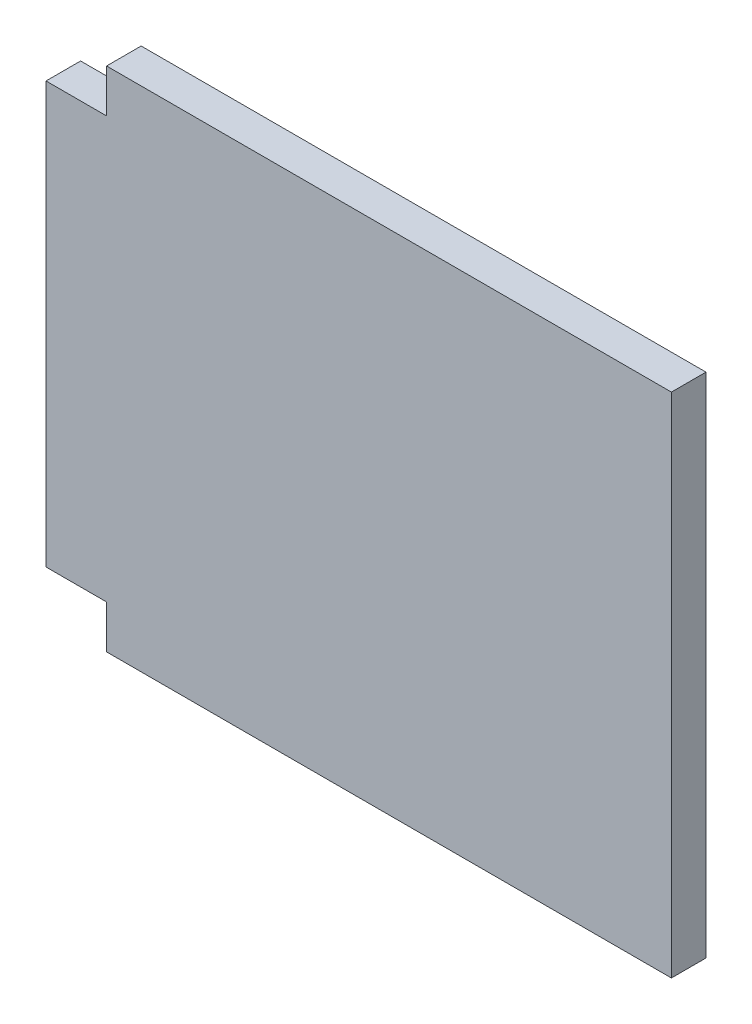
ISO-10303-21;
HEADER;
FILE_DESCRIPTION(('STEP AP214'),'2;1');
FILE_NAME('part.step','',(''),(''),'','','');
FILE_SCHEMA(('AUTOMOTIVE_DESIGN { 1 0 10303 214 1 1 1 1 }'));
ENDSEC;
DATA;
#1=APPLICATION_CONTEXT('core data for automotive mechanical design processes');
#2=APPLICATION_PROTOCOL_DEFINITION('international standard','automotive_design',2000,#1);
#3=PRODUCT_CONTEXT('',#1,'mechanical');
#4=PRODUCT('Part','Part','',(#3));
#5=PRODUCT_RELATED_PRODUCT_CATEGORY('part','',(#4));
#6=PRODUCT_DEFINITION_FORMATION('','',#4);
#7=PRODUCT_DEFINITION_CONTEXT('part definition',#1,'design');
#8=PRODUCT_DEFINITION('design','',#6,#7);
#9=PRODUCT_DEFINITION_SHAPE('','',#8);
#10=(LENGTH_UNIT() NAMED_UNIT(*) SI_UNIT(.MILLI.,.METRE.));
#11=(NAMED_UNIT(*) PLANE_ANGLE_UNIT() SI_UNIT($,.RADIAN.));
#12=(NAMED_UNIT(*) SI_UNIT($,.STERADIAN.) SOLID_ANGLE_UNIT());
#13=UNCERTAINTY_MEASURE_WITH_UNIT(LENGTH_MEASURE(1.E-05),#10,'distance_accuracy_value','');
#14=(GEOMETRIC_REPRESENTATION_CONTEXT(3) GLOBAL_UNCERTAINTY_ASSIGNED_CONTEXT((#13)) GLOBAL_UNIT_ASSIGNED_CONTEXT((#10,
#11,#12)) REPRESENTATION_CONTEXT('',''));
#15=CARTESIAN_POINT('',(0.,0.,0.));
#16=DIRECTION('',(0.,0.,1.));
#17=DIRECTION('',(1.,0.,0.));
#18=AXIS2_PLACEMENT_3D('',#15,#16,#17);
#19=CARTESIAN_POINT('',(0.,0.,0.));
#20=DIRECTION('',(0.,0.,1.));
#21=DIRECTION('',(1.,0.,0.));
#22=AXIS2_PLACEMENT_3D('',#19,#20,#21);
#23=PLANE('',#22);
#24=DIRECTION('',(-1.,0.,0.));
#25=VECTOR('',#24,1.);
#26=CARTESIAN_POINT('',(0.,2.91,0.));
#27=LINE('',#26,#25);
#28=CARTESIAN_POINT('',(-15.3915602948,2.91,0.));
#29=VERTEX_POINT('',#28);
#30=CARTESIAN_POINT('',(-48.0515602948,2.91,0.));
#31=VERTEX_POINT('',#30);
#32=EDGE_CURVE('E128',#29,#31,#27,.T.);
#33=ORIENTED_EDGE('',*,*,#32,.T.);
#34=DIRECTION('',(0.,1.,0.));
#35=VECTOR('',#34,1.);
#36=CARTESIAN_POINT('',(-48.0515602948,0.,0.));
#37=LINE('',#36,#35);
#38=CARTESIAN_POINT('',(-48.0515602948,5.41,0.));
#39=VERTEX_POINT('',#38);
#40=EDGE_CURVE('E123',#31,#39,#37,.T.);
#41=ORIENTED_EDGE('',*,*,#40,.T.);
#42=DIRECTION('',(1.,0.,0.));
#43=VECTOR('',#42,1.);
#44=CARTESIAN_POINT('',(0.,5.41,0.));
#45=LINE('',#44,#43);
#46=CARTESIAN_POINT('',(-51.5515602948,5.41,0.));
#47=VERTEX_POINT('',#46);
#48=EDGE_CURVE('E116',#47,#39,#45,.T.);
#49=ORIENTED_EDGE('',*,*,#48,.F.);
#50=DIRECTION('',(0.,1.,0.));
#51=VECTOR('',#50,1.);
#52=CARTESIAN_POINT('',(-51.5515602948,0.,0.));
#53=LINE('',#52,#51);
#54=CARTESIAN_POINT('',(-51.5515602948,29.75,0.));
#55=VERTEX_POINT('',#54);
#56=EDGE_CURVE('E110',#55,#47,#53,.F.);
#57=ORIENTED_EDGE('',*,*,#56,.F.);
#58=DIRECTION('',(1.,0.,0.));
#59=VECTOR('',#58,1.);
#60=CARTESIAN_POINT('',(0.,29.75,0.));
#61=LINE('',#60,#59);
#62=CARTESIAN_POINT('',(-48.0515602948,29.75,0.));
#63=VERTEX_POINT('',#62);
#64=EDGE_CURVE('E104',#63,#55,#61,.F.);
#65=ORIENTED_EDGE('',*,*,#64,.F.);
#66=DIRECTION('',(0.,1.,0.));
#67=VECTOR('',#66,1.);
#68=CARTESIAN_POINT('',(-48.0515602948,0.,0.));
#69=LINE('',#68,#67);
#70=CARTESIAN_POINT('',(-48.0515602948,32.25,0.));
#71=VERTEX_POINT('',#70);
#72=EDGE_CURVE('E86',#63,#71,#69,.T.);
#73=ORIENTED_EDGE('',*,*,#72,.T.);
#74=DIRECTION('',(-1.,0.,0.));
#75=VECTOR('',#74,1.);
#76=CARTESIAN_POINT('',(0.,32.25,0.));
#77=LINE('',#76,#75);
#78=CARTESIAN_POINT('',(-15.3915602948,32.25,0.));
#79=VERTEX_POINT('',#78);
#80=EDGE_CURVE('E79',#79,#71,#77,.T.);
#81=ORIENTED_EDGE('',*,*,#80,.F.);
#82=DIRECTION('',(0.,1.,0.));
#83=VECTOR('',#82,1.);
#84=CARTESIAN_POINT('',(-15.3915602948,0.,0.));
#85=LINE('',#84,#83);
#86=EDGE_CURVE('E20',#29,#79,#85,.T.);
#87=ORIENTED_EDGE('',*,*,#86,.F.);
#88=EDGE_LOOP('',(#33,#41,#49,#57,#65,#73,#81,#87));
#89=FACE_BOUND('',#88,.T.);
#90=ADVANCED_FACE('F17',(#89),#23,.F.);
#91=CARTESIAN_POINT('',(-15.3915602948,0.,2.));
#92=DIRECTION('',(1.,0.,0.));
#93=DIRECTION('',(0.,0.,-1.));
#94=AXIS2_PLACEMENT_3D('',#91,#92,#93);
#95=PLANE('',#94);
#96=DIRECTION('',(0.,1.,0.));
#97=VECTOR('',#96,1.);
#98=CARTESIAN_POINT('',(-15.3915602948,0.,2.));
#99=LINE('',#98,#97);
#100=CARTESIAN_POINT('',(-15.3915602948,2.91,2.));
#101=VERTEX_POINT('',#100);
#102=CARTESIAN_POINT('',(-15.3915602948,32.25,2.));
#103=VERTEX_POINT('',#102);
#104=EDGE_CURVE('E130',#101,#103,#99,.T.);
#105=ORIENTED_EDGE('',*,*,#104,.F.);
#106=DIRECTION('',(0.,0.,1.));
#107=VECTOR('',#106,1.);
#108=CARTESIAN_POINT('',(-15.3915602948,2.91,2.));
#109=LINE('',#108,#107);
#110=EDGE_CURVE('E93',#101,#29,#109,.F.);
#111=ORIENTED_EDGE('',*,*,#110,.T.);
#112=ORIENTED_EDGE('',*,*,#86,.T.);
#113=DIRECTION('',(0.,0.,1.));
#114=VECTOR('',#113,1.);
#115=CARTESIAN_POINT('',(-15.3915602948,32.25,2.));
#116=LINE('',#115,#114);
#117=EDGE_CURVE('E88',#103,#79,#116,.F.);
#118=ORIENTED_EDGE('',*,*,#117,.F.);
#119=EDGE_LOOP('',(#105,#111,#112,#118));
#120=FACE_BOUND('',#119,.T.);
#121=ADVANCED_FACE('F90',(#120),#95,.T.);
#122=CARTESIAN_POINT('',(0.,32.25,2.));
#123=DIRECTION('',(0.,1.,0.));
#124=DIRECTION('',(-1.,0.,0.));
#125=AXIS2_PLACEMENT_3D('',#122,#123,#124);
#126=PLANE('',#125);
#127=DIRECTION('',(1.,0.,0.));
#128=VECTOR('',#127,1.);
#129=CARTESIAN_POINT('',(0.,32.25,2.));
#130=LINE('',#129,#128);
#131=CARTESIAN_POINT('',(-48.0515602948,32.25,2.));
#132=VERTEX_POINT('',#131);
#133=EDGE_CURVE('E97',#103,#132,#130,.F.);
#134=ORIENTED_EDGE('',*,*,#133,.F.);
#135=ORIENTED_EDGE('',*,*,#117,.T.);
#136=ORIENTED_EDGE('',*,*,#80,.T.);
#137=DIRECTION('',(0.,0.,-1.));
#138=VECTOR('',#137,1.);
#139=CARTESIAN_POINT('',(-48.0515602948,32.25,2.));
#140=LINE('',#139,#138);
#141=EDGE_CURVE('E99',#71,#132,#140,.F.);
#142=ORIENTED_EDGE('',*,*,#141,.T.);
#143=EDGE_LOOP('',(#134,#135,#136,#142));
#144=FACE_BOUND('',#143,.T.);
#145=ADVANCED_FACE('F95',(#144),#126,.T.);
#146=CARTESIAN_POINT('',(-48.0515602948,0.,2.));
#147=DIRECTION('',(1.,0.,0.));
#148=DIRECTION('',(0.,0.,-1.));
#149=AXIS2_PLACEMENT_3D('',#146,#147,#148);
#150=PLANE('',#149);
#151=DIRECTION('',(0.,0.,1.));
#152=VECTOR('',#151,1.);
#153=CARTESIAN_POINT('',(-48.0515602948,29.75,2.));
#154=LINE('',#153,#152);
#155=CARTESIAN_POINT('',(-48.0515602948,29.75,2.));
#156=VERTEX_POINT('',#155);
#157=EDGE_CURVE('E107',#156,#63,#154,.F.);
#158=ORIENTED_EDGE('',*,*,#157,.F.);
#159=DIRECTION('',(0.,1.,0.));
#160=VECTOR('',#159,1.);
#161=CARTESIAN_POINT('',(-48.0515602948,0.,2.));
#162=LINE('',#161,#160);
#163=EDGE_CURVE('E133',#132,#156,#162,.F.);
#164=ORIENTED_EDGE('',*,*,#163,.F.);
#165=ORIENTED_EDGE('',*,*,#141,.F.);
#166=ORIENTED_EDGE('',*,*,#72,.F.);
#167=EDGE_LOOP('',(#158,#164,#165,#166));
#168=FACE_BOUND('',#167,.T.);
#169=ADVANCED_FACE('F174',(#168),#150,.F.);
#170=CARTESIAN_POINT('',(0.,29.75,2.));
#171=DIRECTION('',(0.,1.,0.));
#172=DIRECTION('',(0.,0.,1.));
#173=AXIS2_PLACEMENT_3D('',#170,#171,#172);
#174=PLANE('',#173);
#175=DIRECTION('',(1.,0.,0.));
#176=VECTOR('',#175,1.);
#177=CARTESIAN_POINT('',(0.,29.75,2.));
#178=LINE('',#177,#176);
#179=CARTESIAN_POINT('',(-51.5515602948,29.75,2.));
#180=VERTEX_POINT('',#179);
#181=EDGE_CURVE('E136',#156,#180,#178,.F.);
#182=ORIENTED_EDGE('',*,*,#181,.F.);
#183=ORIENTED_EDGE('',*,*,#157,.T.);
#184=ORIENTED_EDGE('',*,*,#64,.T.);
#185=DIRECTION('',(0.,0.,1.));
#186=VECTOR('',#185,1.);
#187=CARTESIAN_POINT('',(-51.5515602948,29.75,2.));
#188=LINE('',#187,#186);
#189=EDGE_CURVE('E113',#180,#55,#188,.F.);
#190=ORIENTED_EDGE('',*,*,#189,.F.);
#191=EDGE_LOOP('',(#182,#183,#184,#190));
#192=FACE_BOUND('',#191,.T.);
#193=ADVANCED_FACE('F170',(#192),#174,.T.);
#194=CARTESIAN_POINT('',(-51.5515602948,0.,2.));
#195=DIRECTION('',(-1.,0.,0.));
#196=DIRECTION('',(0.,0.,1.));
#197=AXIS2_PLACEMENT_3D('',#194,#195,#196);
#198=PLANE('',#197);
#199=DIRECTION('',(0.,1.,0.));
#200=VECTOR('',#199,1.);
#201=CARTESIAN_POINT('',(-51.5515602948,0.,2.));
#202=LINE('',#201,#200);
#203=CARTESIAN_POINT('',(-51.5515602948,5.41,2.));
#204=VERTEX_POINT('',#203);
#205=EDGE_CURVE('E139',#180,#204,#202,.F.);
#206=ORIENTED_EDGE('',*,*,#205,.F.);
#207=ORIENTED_EDGE('',*,*,#189,.T.);
#208=ORIENTED_EDGE('',*,*,#56,.T.);
#209=DIRECTION('',(0.,0.,-1.));
#210=VECTOR('',#209,1.);
#211=CARTESIAN_POINT('',(-51.5515602948,5.41,2.));
#212=LINE('',#211,#210);
#213=EDGE_CURVE('E118',#204,#47,#212,.T.);
#214=ORIENTED_EDGE('',*,*,#213,.F.);
#215=EDGE_LOOP('',(#206,#207,#208,#214));
#216=FACE_BOUND('',#215,.T.);
#217=ADVANCED_FACE('F167',(#216),#198,.T.);
#218=CARTESIAN_POINT('',(0.,5.41,2.));
#219=DIRECTION('',(0.,-1.,0.));
#220=DIRECTION('',(0.,0.,-1.));
#221=AXIS2_PLACEMENT_3D('',#218,#219,#220);
#222=PLANE('',#221);
#223=DIRECTION('',(1.,0.,0.));
#224=VECTOR('',#223,1.);
#225=CARTESIAN_POINT('',(0.,5.41,2.));
#226=LINE('',#225,#224);
#227=CARTESIAN_POINT('',(-48.0515602948,5.41,2.));
#228=VERTEX_POINT('',#227);
#229=EDGE_CURVE('E142',#204,#228,#226,.T.);
#230=ORIENTED_EDGE('',*,*,#229,.F.);
#231=ORIENTED_EDGE('',*,*,#213,.T.);
#232=ORIENTED_EDGE('',*,*,#48,.T.);
#233=DIRECTION('',(0.,0.,-1.));
#234=VECTOR('',#233,1.);
#235=CARTESIAN_POINT('',(-48.0515602948,5.41,2.));
#236=LINE('',#235,#234);
#237=EDGE_CURVE('E121',#39,#228,#236,.F.);
#238=ORIENTED_EDGE('',*,*,#237,.T.);
#239=EDGE_LOOP('',(#230,#231,#232,#238));
#240=FACE_BOUND('',#239,.T.);
#241=ADVANCED_FACE('F152',(#240),#222,.T.);
#242=CARTESIAN_POINT('',(-48.0515602948,0.,2.));
#243=DIRECTION('',(1.,0.,0.));
#244=DIRECTION('',(0.,0.,-1.));
#245=AXIS2_PLACEMENT_3D('',#242,#243,#244);
#246=PLANE('',#245);
#247=DIRECTION('',(0.,0.,1.));
#248=VECTOR('',#247,1.);
#249=CARTESIAN_POINT('',(-48.0515602948,2.91000000000001,2.));
#250=LINE('',#249,#248);
#251=CARTESIAN_POINT('',(-48.0515602948,2.91,2.));
#252=VERTEX_POINT('',#251);
#253=EDGE_CURVE('E35',#31,#252,#250,.T.);
#254=ORIENTED_EDGE('',*,*,#253,.T.);
#255=DIRECTION('',(0.,1.,0.));
#256=VECTOR('',#255,1.);
#257=CARTESIAN_POINT('',(-48.0515602948,0.,2.));
#258=LINE('',#257,#256);
#259=EDGE_CURVE('E26',#228,#252,#258,.F.);
#260=ORIENTED_EDGE('',*,*,#259,.F.);
#261=ORIENTED_EDGE('',*,*,#237,.F.);
#262=ORIENTED_EDGE('',*,*,#40,.F.);
#263=EDGE_LOOP('',(#254,#260,#261,#262));
#264=FACE_BOUND('',#263,.T.);
#265=ADVANCED_FACE('F150',(#264),#246,.F.);
#266=CARTESIAN_POINT('',(0.,2.91,2.));
#267=DIRECTION('',(0.,1.,0.));
#268=DIRECTION('',(-1.,0.,0.));
#269=AXIS2_PLACEMENT_3D('',#266,#267,#268);
#270=PLANE('',#269);
#271=ORIENTED_EDGE('',*,*,#110,.F.);
#272=DIRECTION('',(1.,0.,0.));
#273=VECTOR('',#272,1.);
#274=CARTESIAN_POINT('',(0.,2.91,2.));
#275=LINE('',#274,#273);
#276=EDGE_CURVE('E11',#252,#101,#275,.T.);
#277=ORIENTED_EDGE('',*,*,#276,.F.);
#278=ORIENTED_EDGE('',*,*,#253,.F.);
#279=ORIENTED_EDGE('',*,*,#32,.F.);
#280=EDGE_LOOP('',(#271,#277,#278,#279));
#281=FACE_BOUND('',#280,.T.);
#282=ADVANCED_FACE('F154',(#281),#270,.F.);
#283=CARTESIAN_POINT('',(0.,0.,2.));
#284=DIRECTION('',(0.,0.,1.));
#285=DIRECTION('',(1.,0.,0.));
#286=AXIS2_PLACEMENT_3D('',#283,#284,#285);
#287=PLANE('',#286);
#288=ORIENTED_EDGE('',*,*,#259,.T.);
#289=ORIENTED_EDGE('',*,*,#276,.T.);
#290=ORIENTED_EDGE('',*,*,#104,.T.);
#291=ORIENTED_EDGE('',*,*,#133,.T.);
#292=ORIENTED_EDGE('',*,*,#163,.T.);
#293=ORIENTED_EDGE('',*,*,#181,.T.);
#294=ORIENTED_EDGE('',*,*,#205,.T.);
#295=ORIENTED_EDGE('',*,*,#229,.T.);
#296=EDGE_LOOP('',(#288,#289,#290,#291,#292,#293,#294,#295));
#297=FACE_BOUND('',#296,.T.);
#298=ADVANCED_FACE('F147',(#297),#287,.T.);
#299=CLOSED_SHELL('',(#90,#121,#145,#169,#193,#217,#241,#265,#282,#298));
#300=MANIFOLD_SOLID_BREP('B1',#299);
#301=ADVANCED_BREP_SHAPE_REPRESENTATION('',(#18,#300),#14);
#302=SHAPE_DEFINITION_REPRESENTATION(#9,#301);
ENDSEC;
END-ISO-10303-21;
